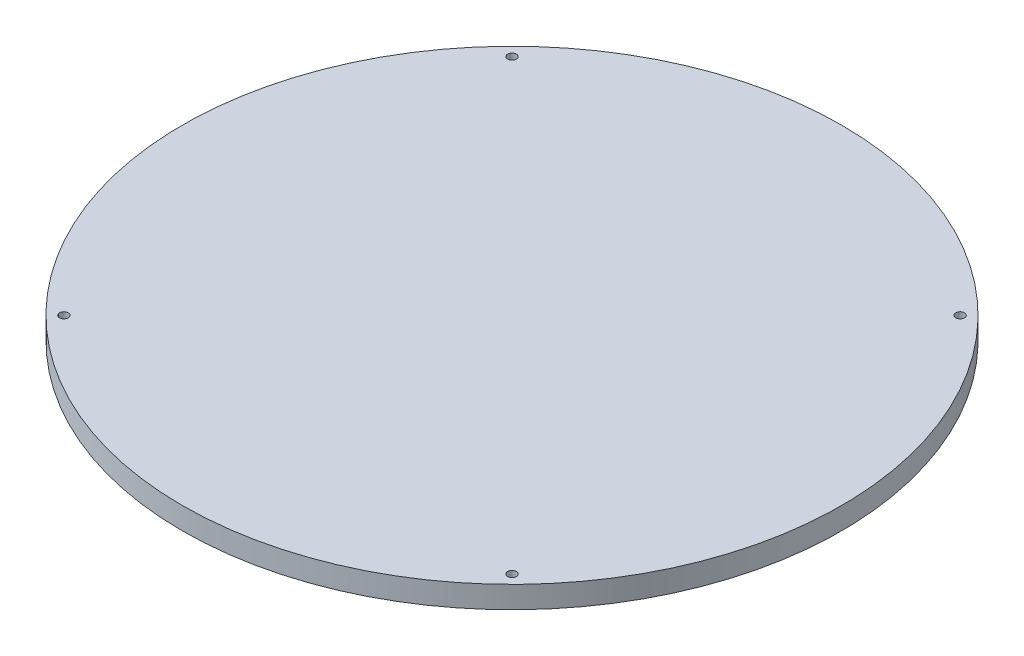
ISO-10303-21;
HEADER;
FILE_DESCRIPTION(('STEP AP214'),'2;1');
FILE_NAME('part.step','',(''),(''),'','','');
FILE_SCHEMA(('AUTOMOTIVE_DESIGN { 1 0 10303 214 1 1 1 1 }'));
ENDSEC;
DATA;
#1=APPLICATION_CONTEXT('core data for automotive mechanical design processes');
#2=APPLICATION_PROTOCOL_DEFINITION('international standard','automotive_design',2000,#1);
#3=PRODUCT_CONTEXT('',#1,'mechanical');
#4=PRODUCT('Part','Part','',(#3));
#5=PRODUCT_RELATED_PRODUCT_CATEGORY('part','',(#4));
#6=PRODUCT_DEFINITION_FORMATION('','',#4);
#7=PRODUCT_DEFINITION_CONTEXT('part definition',#1,'design');
#8=PRODUCT_DEFINITION('design','',#6,#7);
#9=PRODUCT_DEFINITION_SHAPE('','',#8);
#10=(LENGTH_UNIT() NAMED_UNIT(*) SI_UNIT(.MILLI.,.METRE.));
#11=(NAMED_UNIT(*) PLANE_ANGLE_UNIT() SI_UNIT($,.RADIAN.));
#12=(NAMED_UNIT(*) SI_UNIT($,.STERADIAN.) SOLID_ANGLE_UNIT());
#13=UNCERTAINTY_MEASURE_WITH_UNIT(LENGTH_MEASURE(1.E-05),#10,'distance_accuracy_value','');
#14=(GEOMETRIC_REPRESENTATION_CONTEXT(3) GLOBAL_UNCERTAINTY_ASSIGNED_CONTEXT((#13)) GLOBAL_UNIT_ASSIGNED_CONTEXT((#10,
#11,#12)) REPRESENTATION_CONTEXT('',''));
#15=CARTESIAN_POINT('',(0.,0.,0.));
#16=DIRECTION('',(0.,0.,1.));
#17=DIRECTION('',(1.,0.,0.));
#18=AXIS2_PLACEMENT_3D('',#15,#16,#17);
#19=CARTESIAN_POINT('',(0.,10.,0.));
#20=DIRECTION('',(0.,-1.,0.));
#21=DIRECTION('',(0.,0.,-1.));
#22=AXIS2_PLACEMENT_3D('',#19,#20,#21);
#23=CYLINDRICAL_SURFACE('',#22,150.);
#24=CARTESIAN_POINT('',(0.,10.,0.));
#25=DIRECTION('',(0.,1.,0.));
#26=DIRECTION('',(0.,0.,1.));
#27=AXIS2_PLACEMENT_3D('',#24,#25,#26);
#28=CIRCLE('',#27,150.);
#29=CARTESIAN_POINT('',(0.,10.,150.));
#30=VERTEX_POINT('',#29);
#31=EDGE_CURVE('E10',#30,#30,#28,.T.);
#32=ORIENTED_EDGE('',*,*,#31,.F.);
#33=EDGE_LOOP('',(#32));
#34=FACE_BOUND('',#33,.T.);
#35=CARTESIAN_POINT('',(0.,0.,0.));
#36=DIRECTION('',(0.,1.,0.));
#37=DIRECTION('',(0.,0.,1.));
#38=AXIS2_PLACEMENT_3D('',#35,#36,#37);
#39=CIRCLE('',#38,150.);
#40=CARTESIAN_POINT('',(0.,0.,150.));
#41=VERTEX_POINT('',#40);
#42=EDGE_CURVE('E44',#41,#41,#39,.T.);
#43=ORIENTED_EDGE('',*,*,#42,.T.);
#44=EDGE_LOOP('',(#43));
#45=FACE_BOUND('',#44,.T.);
#46=ADVANCED_FACE('F41',(#34,#45),#23,.T.);
#47=CARTESIAN_POINT('',(0.,10.,0.));
#48=DIRECTION('',(0.,1.,0.));
#49=DIRECTION('',(0.,0.,1.));
#50=AXIS2_PLACEMENT_3D('',#47,#48,#49);
#51=PLANE('',#50);
#52=CARTESIAN_POINT('',(-101.974532959341,10.,-101.974532959329));
#53=DIRECTION('',(0.,1.,0.));
#54=DIRECTION('',(0.,0.,1.));
#55=AXIS2_PLACEMENT_3D('',#52,#53,#54);
#56=CIRCLE('',#55,2.00000000001144);
#57=CARTESIAN_POINT('',(-101.974532959341,10.,-99.974532959318));
#58=VERTEX_POINT('',#57);
#59=EDGE_CURVE('E67',#58,#58,#56,.T.);
#60=ORIENTED_EDGE('',*,*,#59,.F.);
#61=EDGE_LOOP('',(#60));
#62=FACE_BOUND('',#61,.T.);
#63=CARTESIAN_POINT('',(-101.974532959329,10.,101.974532959352));
#64=DIRECTION('',(0.,1.,0.));
#65=DIRECTION('',(0.,0.,1.));
#66=AXIS2_PLACEMENT_3D('',#63,#64,#65);
#67=CIRCLE('',#66,2.00000000000792);
#68=CARTESIAN_POINT('',(-101.974532959329,10.,103.97453295936));
#69=VERTEX_POINT('',#68);
#70=EDGE_CURVE('E75',#69,#69,#67,.T.);
#71=ORIENTED_EDGE('',*,*,#70,.F.);
#72=EDGE_LOOP('',(#71));
#73=FACE_BOUND('',#72,.T.);
#74=CARTESIAN_POINT('',(101.974532959352,10.,101.974532959341));
#75=DIRECTION('',(0.,1.,0.));
#76=DIRECTION('',(0.,0.,1.));
#77=AXIS2_PLACEMENT_3D('',#74,#75,#76);
#78=CIRCLE('',#77,1.99999999999681);
#79=CARTESIAN_POINT('',(101.974532959352,10.,103.974532959338));
#80=VERTEX_POINT('',#79);
#81=EDGE_CURVE('E59',#80,#80,#78,.T.);
#82=ORIENTED_EDGE('',*,*,#81,.F.);
#83=EDGE_LOOP('',(#82));
#84=FACE_BOUND('',#83,.T.);
#85=CARTESIAN_POINT('',(101.974532959341,10.,-101.974532959341));
#86=DIRECTION('',(0.,1.,0.));
#87=DIRECTION('',(0.,0.,1.));
#88=AXIS2_PLACEMENT_3D('',#85,#86,#87);
#89=CIRCLE('',#88,2.);
#90=CARTESIAN_POINT('',(101.974532959341,10.,-99.9745329593409));
#91=VERTEX_POINT('',#90);
#92=EDGE_CURVE('E55',#91,#91,#89,.T.);
#93=ORIENTED_EDGE('',*,*,#92,.F.);
#94=EDGE_LOOP('',(#93));
#95=FACE_BOUND('',#94,.T.);
#96=ORIENTED_EDGE('',*,*,#31,.T.);
#97=EDGE_LOOP('',(#96));
#98=FACE_BOUND('',#97,.T.);
#99=ADVANCED_FACE('F89',(#62,#73,#84,#95,#98),#51,.T.);
#100=CARTESIAN_POINT('',(0.,0.,0.));
#101=DIRECTION('',(0.,1.,0.));
#102=DIRECTION('',(0.,0.,1.));
#103=AXIS2_PLACEMENT_3D('',#100,#101,#102);
#104=PLANE('',#103);
#105=CARTESIAN_POINT('',(-101.974532959341,0.,-101.974532959329));
#106=DIRECTION('',(0.,1.,0.));
#107=DIRECTION('',(0.,0.,1.));
#108=AXIS2_PLACEMENT_3D('',#105,#106,#107);
#109=CIRCLE('',#108,2.00000000001144);
#110=CARTESIAN_POINT('',(-101.974532959341,0.,-99.974532959318));
#111=VERTEX_POINT('',#110);
#112=EDGE_CURVE('E63',#111,#111,#109,.T.);
#113=ORIENTED_EDGE('',*,*,#112,.T.);
#114=EDGE_LOOP('',(#113));
#115=FACE_BOUND('',#114,.T.);
#116=CARTESIAN_POINT('',(-101.974532959329,0.,101.974532959352));
#117=DIRECTION('',(0.,1.,0.));
#118=DIRECTION('',(0.,0.,1.));
#119=AXIS2_PLACEMENT_3D('',#116,#117,#118);
#120=CIRCLE('',#119,2.00000000000792);
#121=CARTESIAN_POINT('',(-101.974532959329,0.,103.97453295936));
#122=VERTEX_POINT('',#121);
#123=EDGE_CURVE('E71',#122,#122,#120,.T.);
#124=ORIENTED_EDGE('',*,*,#123,.T.);
#125=EDGE_LOOP('',(#124));
#126=FACE_BOUND('',#125,.T.);
#127=CARTESIAN_POINT('',(101.974532959352,0.,101.974532959341));
#128=DIRECTION('',(0.,1.,0.));
#129=DIRECTION('',(0.,0.,1.));
#130=AXIS2_PLACEMENT_3D('',#127,#128,#129);
#131=CIRCLE('',#130,1.99999999999681);
#132=CARTESIAN_POINT('',(101.974532959352,0.,103.974532959338));
#133=VERTEX_POINT('',#132);
#134=EDGE_CURVE('E79',#133,#133,#131,.T.);
#135=ORIENTED_EDGE('',*,*,#134,.T.);
#136=EDGE_LOOP('',(#135));
#137=FACE_BOUND('',#136,.T.);
#138=CARTESIAN_POINT('',(101.974532959341,0.,-101.974532959341));
#139=DIRECTION('',(0.,1.,0.));
#140=DIRECTION('',(0.,0.,1.));
#141=AXIS2_PLACEMENT_3D('',#138,#139,#140);
#142=CIRCLE('',#141,2.);
#143=CARTESIAN_POINT('',(101.974532959341,0.,-99.9745329593409));
#144=VERTEX_POINT('',#143);
#145=EDGE_CURVE('E53',#144,#144,#142,.T.);
#146=ORIENTED_EDGE('',*,*,#145,.T.);
#147=EDGE_LOOP('',(#146));
#148=FACE_BOUND('',#147,.T.);
#149=ORIENTED_EDGE('',*,*,#42,.F.);
#150=EDGE_LOOP('',(#149));
#151=FACE_BOUND('',#150,.T.);
#152=ADVANCED_FACE('F92',(#115,#126,#137,#148,#151),#104,.F.);
#153=CARTESIAN_POINT('',(101.974532959341,0.,-101.974532959341));
#154=DIRECTION('',(0.,1.,0.));
#155=DIRECTION('',(0.,0.,1.));
#156=AXIS2_PLACEMENT_3D('',#153,#154,#155);
#157=CYLINDRICAL_SURFACE('',#156,2.);
#158=ORIENTED_EDGE('',*,*,#145,.F.);
#159=EDGE_LOOP('',(#158));
#160=FACE_BOUND('',#159,.T.);
#161=ORIENTED_EDGE('',*,*,#92,.T.);
#162=EDGE_LOOP('',(#161));
#163=FACE_BOUND('',#162,.T.);
#164=ADVANCED_FACE('F97',(#160,#163),#157,.F.);
#165=CARTESIAN_POINT('',(101.974532959352,0.,101.974532959341));
#166=DIRECTION('',(0.,1.,0.));
#167=DIRECTION('',(0.,0.,1.));
#168=AXIS2_PLACEMENT_3D('',#165,#166,#167);
#169=CYLINDRICAL_SURFACE('',#168,1.99999999999681);
#170=ORIENTED_EDGE('',*,*,#134,.F.);
#171=EDGE_LOOP('',(#170));
#172=FACE_BOUND('',#171,.T.);
#173=ORIENTED_EDGE('',*,*,#81,.T.);
#174=EDGE_LOOP('',(#173));
#175=FACE_BOUND('',#174,.T.);
#176=ADVANCED_FACE('F87',(#172,#175),#169,.F.);
#177=CARTESIAN_POINT('',(-101.974532959329,0.,101.974532959352));
#178=DIRECTION('',(0.,1.,0.));
#179=DIRECTION('',(0.,0.,1.));
#180=AXIS2_PLACEMENT_3D('',#177,#178,#179);
#181=CYLINDRICAL_SURFACE('',#180,2.00000000000792);
#182=ORIENTED_EDGE('',*,*,#123,.F.);
#183=EDGE_LOOP('',(#182));
#184=FACE_BOUND('',#183,.T.);
#185=ORIENTED_EDGE('',*,*,#70,.T.);
#186=EDGE_LOOP('',(#185));
#187=FACE_BOUND('',#186,.T.);
#188=ADVANCED_FACE('F105',(#184,#187),#181,.F.);
#189=CARTESIAN_POINT('',(-101.974532959341,0.,-101.974532959329));
#190=DIRECTION('',(0.,1.,0.));
#191=DIRECTION('',(0.,0.,1.));
#192=AXIS2_PLACEMENT_3D('',#189,#190,#191);
#193=CYLINDRICAL_SURFACE('',#192,2.00000000001144);
#194=ORIENTED_EDGE('',*,*,#112,.F.);
#195=EDGE_LOOP('',(#194));
#196=FACE_BOUND('',#195,.T.);
#197=ORIENTED_EDGE('',*,*,#59,.T.);
#198=EDGE_LOOP('',(#197));
#199=FACE_BOUND('',#198,.T.);
#200=ADVANCED_FACE('F148',(#196,#199),#193,.F.);
#201=CLOSED_SHELL('',(#46,#99,#152,#164,#176,#188,#200));
#202=MANIFOLD_SOLID_BREP('B2',#201);
#203=ADVANCED_BREP_SHAPE_REPRESENTATION('',(#18,#202),#14);
#204=SHAPE_DEFINITION_REPRESENTATION(#9,#203);
ENDSEC;
END-ISO-10303-21;
